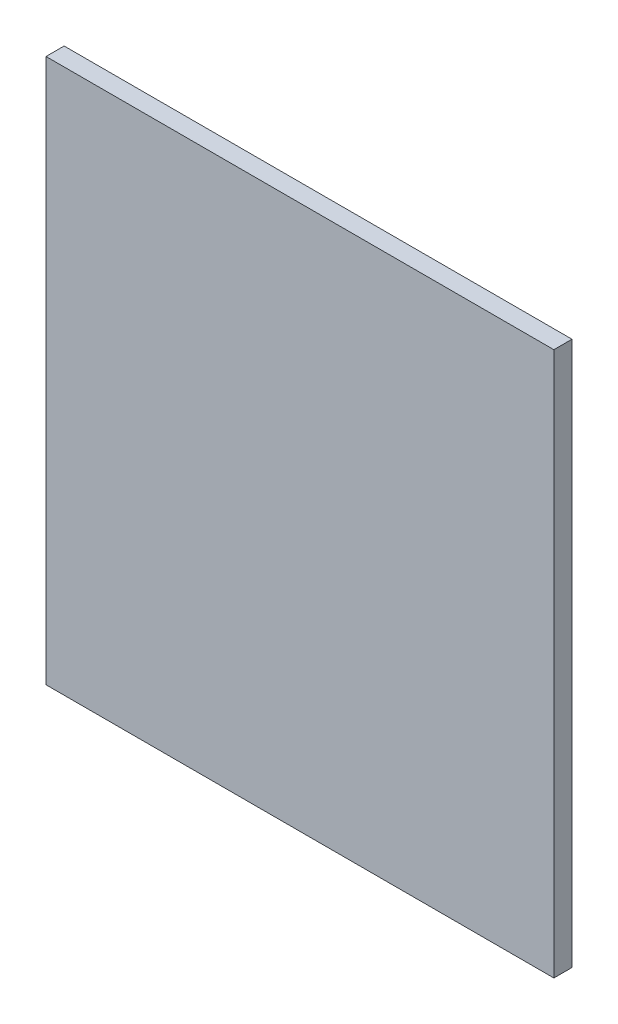
ISO-10303-21;
HEADER;
FILE_DESCRIPTION(('STEP AP214'),'2;1');
FILE_NAME('part.step','',(''),(''),'','','');
FILE_SCHEMA(('AUTOMOTIVE_DESIGN { 1 0 10303 214 1 1 1 1 }'));
ENDSEC;
DATA;
#1=APPLICATION_CONTEXT('core data for automotive mechanical design processes');
#2=APPLICATION_PROTOCOL_DEFINITION('international standard','automotive_design',2000,#1);
#3=PRODUCT_CONTEXT('',#1,'mechanical');
#4=PRODUCT('Part','Part','',(#3));
#5=PRODUCT_RELATED_PRODUCT_CATEGORY('part','',(#4));
#6=PRODUCT_DEFINITION_FORMATION('','',#4);
#7=PRODUCT_DEFINITION_CONTEXT('part definition',#1,'design');
#8=PRODUCT_DEFINITION('design','',#6,#7);
#9=PRODUCT_DEFINITION_SHAPE('','',#8);
#10=(LENGTH_UNIT() NAMED_UNIT(*) SI_UNIT(.MILLI.,.METRE.));
#11=(NAMED_UNIT(*) PLANE_ANGLE_UNIT() SI_UNIT($,.RADIAN.));
#12=(NAMED_UNIT(*) SI_UNIT($,.STERADIAN.) SOLID_ANGLE_UNIT());
#13=UNCERTAINTY_MEASURE_WITH_UNIT(LENGTH_MEASURE(1.E-05),#10,'distance_accuracy_value','');
#14=(GEOMETRIC_REPRESENTATION_CONTEXT(3) GLOBAL_UNCERTAINTY_ASSIGNED_CONTEXT((#13)) GLOBAL_UNIT_ASSIGNED_CONTEXT((#10,
#11,#12)) REPRESENTATION_CONTEXT('',''));
#15=CARTESIAN_POINT('',(0.,0.,0.));
#16=DIRECTION('',(0.,0.,1.));
#17=DIRECTION('',(1.,0.,0.));
#18=AXIS2_PLACEMENT_3D('',#15,#16,#17);
#19=CARTESIAN_POINT('',(-44.237704694695,27.7267703877279,2.54));
#20=DIRECTION('',(1.,0.,0.));
#21=DIRECTION('',(0.,1.,0.));
#22=AXIS2_PLACEMENT_3D('',#19,#20,#21);
#23=PLANE('',#22);
#24=DIRECTION('',(0.,-1.,0.));
#25=VECTOR('',#24,1.);
#26=CARTESIAN_POINT('',(-44.237704694695,27.7267703877279,0.));
#27=LINE('',#26,#25);
#28=CARTESIAN_POINT('',(-44.237704694695,27.7267703877279,0.));
#29=VERTEX_POINT('',#28);
#30=CARTESIAN_POINT('',(-44.237704694695,-48.4732296122721,0.));
#31=VERTEX_POINT('',#30);
#32=EDGE_CURVE('E96',#29,#31,#27,.T.);
#33=ORIENTED_EDGE('',*,*,#32,.T.);
#34=DIRECTION('',(0.,0.,-1.));
#35=VECTOR('',#34,1.);
#36=CARTESIAN_POINT('',(-44.237704694695,-48.4732296122721,2.54));
#37=LINE('',#36,#35);
#38=CARTESIAN_POINT('',(-44.237704694695,-48.4732296122721,2.54));
#39=VERTEX_POINT('',#38);
#40=EDGE_CURVE('E11',#39,#31,#37,.T.);
#41=ORIENTED_EDGE('',*,*,#40,.F.);
#42=DIRECTION('',(0.,-1.,0.));
#43=VECTOR('',#42,1.);
#44=CARTESIAN_POINT('',(-44.237704694695,27.7267703877279,2.54));
#45=LINE('',#44,#43);
#46=CARTESIAN_POINT('',(-44.237704694695,27.7267703877279,2.54));
#47=VERTEX_POINT('',#46);
#48=EDGE_CURVE('E84',#47,#39,#45,.T.);
#49=ORIENTED_EDGE('',*,*,#48,.F.);
#50=DIRECTION('',(0.,0.,-1.));
#51=VECTOR('',#50,1.);
#52=CARTESIAN_POINT('',(-44.237704694695,27.7267703877279,2.54));
#53=LINE('',#52,#51);
#54=EDGE_CURVE('E92',#47,#29,#53,.T.);
#55=ORIENTED_EDGE('',*,*,#54,.T.);
#56=EDGE_LOOP('',(#33,#41,#49,#55));
#57=FACE_BOUND('',#56,.T.);
#58=ADVANCED_FACE('F33',(#57),#23,.F.);
#59=CARTESIAN_POINT('',(-44.237704694695,-48.4732296122721,2.54));
#60=DIRECTION('',(0.,1.,0.));
#61=DIRECTION('',(0.,0.,1.));
#62=AXIS2_PLACEMENT_3D('',#59,#60,#61);
#63=PLANE('',#62);
#64=DIRECTION('',(1.,0.,0.));
#65=VECTOR('',#64,1.);
#66=CARTESIAN_POINT('',(-44.237704694695,-48.4732296122721,0.));
#67=LINE('',#66,#65);
#68=CARTESIAN_POINT('',(26.882295305305,-48.4732296122721,0.));
#69=VERTEX_POINT('',#68);
#70=EDGE_CURVE('E88',#31,#69,#67,.T.);
#71=ORIENTED_EDGE('',*,*,#70,.T.);
#72=DIRECTION('',(0.,0.,-1.));
#73=VECTOR('',#72,1.);
#74=CARTESIAN_POINT('',(26.882295305305,-48.4732296122721,2.54));
#75=LINE('',#74,#73);
#76=CARTESIAN_POINT('',(26.882295305305,-48.4732296122721,2.54));
#77=VERTEX_POINT('',#76);
#78=EDGE_CURVE('E41',#77,#69,#75,.T.);
#79=ORIENTED_EDGE('',*,*,#78,.F.);
#80=DIRECTION('',(1.,0.,0.));
#81=VECTOR('',#80,1.);
#82=CARTESIAN_POINT('',(-44.237704694695,-48.4732296122721,2.54));
#83=LINE('',#82,#81);
#84=EDGE_CURVE('E79',#39,#77,#83,.T.);
#85=ORIENTED_EDGE('',*,*,#84,.F.);
#86=ORIENTED_EDGE('',*,*,#40,.T.);
#87=EDGE_LOOP('',(#71,#79,#85,#86));
#88=FACE_BOUND('',#87,.T.);
#89=ADVANCED_FACE('F87',(#88),#63,.F.);
#90=CARTESIAN_POINT('',(26.882295305305,27.7267703877279,2.54));
#91=DIRECTION('',(-1.,0.,0.));
#92=DIRECTION('',(0.,-1.,0.));
#93=AXIS2_PLACEMENT_3D('',#90,#91,#92);
#94=PLANE('',#93);
#95=DIRECTION('',(0.,1.,0.));
#96=VECTOR('',#95,1.);
#97=CARTESIAN_POINT('',(26.882295305305,27.7267703877279,0.));
#98=LINE('',#97,#96);
#99=CARTESIAN_POINT('',(26.882295305305,27.7267703877279,0.));
#100=VERTEX_POINT('',#99);
#101=EDGE_CURVE('E66',#69,#100,#98,.T.);
#102=ORIENTED_EDGE('',*,*,#101,.T.);
#103=DIRECTION('',(0.,0.,-1.));
#104=VECTOR('',#103,1.);
#105=CARTESIAN_POINT('',(26.882295305305,27.7267703877279,2.54));
#106=LINE('',#105,#104);
#107=CARTESIAN_POINT('',(26.882295305305,27.7267703877279,2.54));
#108=VERTEX_POINT('',#107);
#109=EDGE_CURVE('E89',#108,#100,#106,.T.);
#110=ORIENTED_EDGE('',*,*,#109,.F.);
#111=DIRECTION('',(0.,1.,0.));
#112=VECTOR('',#111,1.);
#113=CARTESIAN_POINT('',(26.882295305305,27.7267703877279,2.54));
#114=LINE('',#113,#112);
#115=EDGE_CURVE('E82',#77,#108,#114,.T.);
#116=ORIENTED_EDGE('',*,*,#115,.F.);
#117=ORIENTED_EDGE('',*,*,#78,.T.);
#118=EDGE_LOOP('',(#102,#110,#116,#117));
#119=FACE_BOUND('',#118,.T.);
#120=ADVANCED_FACE('F90',(#119),#94,.F.);
#121=CARTESIAN_POINT('',(-44.237704694695,27.7267703877279,2.54));
#122=DIRECTION('',(0.,-1.,0.));
#123=DIRECTION('',(0.,0.,-1.));
#124=AXIS2_PLACEMENT_3D('',#121,#122,#123);
#125=PLANE('',#124);
#126=DIRECTION('',(-1.,0.,0.));
#127=VECTOR('',#126,1.);
#128=CARTESIAN_POINT('',(-44.237704694695,27.7267703877279,0.));
#129=LINE('',#128,#127);
#130=EDGE_CURVE('E72',#100,#29,#129,.T.);
#131=ORIENTED_EDGE('',*,*,#130,.T.);
#132=ORIENTED_EDGE('',*,*,#54,.F.);
#133=DIRECTION('',(-1.,0.,0.));
#134=VECTOR('',#133,1.);
#135=CARTESIAN_POINT('',(-44.237704694695,27.7267703877279,2.54));
#136=LINE('',#135,#134);
#137=EDGE_CURVE('E49',#108,#47,#136,.T.);
#138=ORIENTED_EDGE('',*,*,#137,.F.);
#139=ORIENTED_EDGE('',*,*,#109,.T.);
#140=EDGE_LOOP('',(#131,#132,#138,#139));
#141=FACE_BOUND('',#140,.T.);
#142=ADVANCED_FACE('F103',(#141),#125,.F.);
#143=CARTESIAN_POINT('',(0.,0.,2.54));
#144=DIRECTION('',(0.,0.,1.));
#145=DIRECTION('',(1.,0.,0.));
#146=AXIS2_PLACEMENT_3D('',#143,#144,#145);
#147=PLANE('',#146);
#148=ORIENTED_EDGE('',*,*,#48,.T.);
#149=ORIENTED_EDGE('',*,*,#84,.T.);
#150=ORIENTED_EDGE('',*,*,#115,.T.);
#151=ORIENTED_EDGE('',*,*,#137,.T.);
#152=EDGE_LOOP('',(#148,#149,#150,#151));
#153=FACE_BOUND('',#152,.T.);
#154=ADVANCED_FACE('F80',(#153),#147,.T.);
#155=CARTESIAN_POINT('',(0.,0.,0.));
#156=DIRECTION('',(0.,0.,1.));
#157=DIRECTION('',(1.,0.,0.));
#158=AXIS2_PLACEMENT_3D('',#155,#156,#157);
#159=PLANE('',#158);
#160=ORIENTED_EDGE('',*,*,#32,.F.);
#161=ORIENTED_EDGE('',*,*,#130,.F.);
#162=ORIENTED_EDGE('',*,*,#101,.F.);
#163=ORIENTED_EDGE('',*,*,#70,.F.);
#164=EDGE_LOOP('',(#160,#161,#162,#163));
#165=FACE_BOUND('',#164,.T.);
#166=ADVANCED_FACE('F106',(#165),#159,.F.);
#167=CLOSED_SHELL('',(#58,#89,#120,#142,#154,#166));
#168=MANIFOLD_SOLID_BREP('B2',#167);
#169=ADVANCED_BREP_SHAPE_REPRESENTATION('',(#18,#168),#14);
#170=SHAPE_DEFINITION_REPRESENTATION(#9,#169);
ENDSEC;
END-ISO-10303-21;
